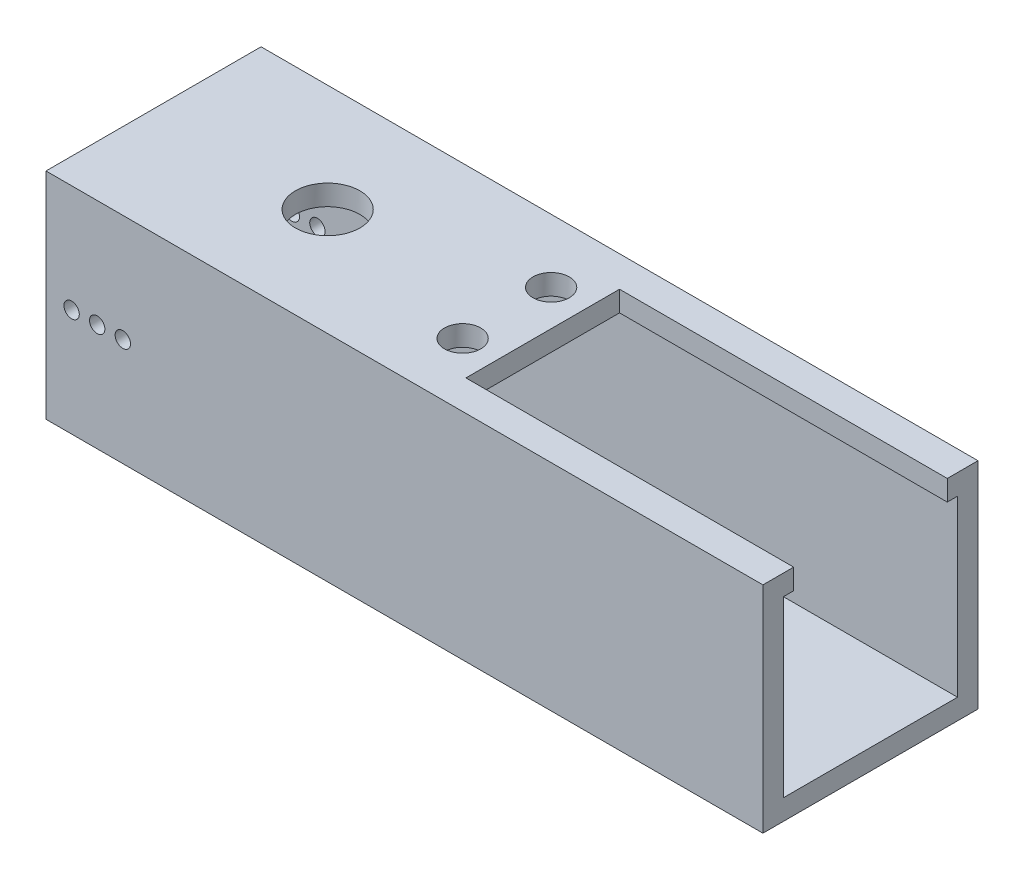
ISO-10303-21;
HEADER;
FILE_DESCRIPTION(('STEP AP214'),'2;1');
FILE_NAME('part.step','',(''),(''),'','','');
FILE_SCHEMA(('AUTOMOTIVE_DESIGN { 1 0 10303 214 1 1 1 1 }'));
ENDSEC;
DATA;
#1=APPLICATION_CONTEXT('core data for automotive mechanical design processes');
#2=APPLICATION_PROTOCOL_DEFINITION('international standard','automotive_design',2000,#1);
#3=PRODUCT_CONTEXT('',#1,'mechanical');
#4=PRODUCT('Part','Part','',(#3));
#5=PRODUCT_RELATED_PRODUCT_CATEGORY('part','',(#4));
#6=PRODUCT_DEFINITION_FORMATION('','',#4);
#7=PRODUCT_DEFINITION_CONTEXT('part definition',#1,'design');
#8=PRODUCT_DEFINITION('design','',#6,#7);
#9=PRODUCT_DEFINITION_SHAPE('','',#8);
#10=(LENGTH_UNIT() NAMED_UNIT(*) SI_UNIT(.MILLI.,.METRE.));
#11=(NAMED_UNIT(*) PLANE_ANGLE_UNIT() SI_UNIT($,.RADIAN.));
#12=(NAMED_UNIT(*) SI_UNIT($,.STERADIAN.) SOLID_ANGLE_UNIT());
#13=UNCERTAINTY_MEASURE_WITH_UNIT(LENGTH_MEASURE(1.E-05),#10,'distance_accuracy_value','');
#14=(GEOMETRIC_REPRESENTATION_CONTEXT(3) GLOBAL_UNCERTAINTY_ASSIGNED_CONTEXT((#13)) GLOBAL_UNIT_ASSIGNED_CONTEXT((#10,
#11,#12)) REPRESENTATION_CONTEXT('',''));
#15=CARTESIAN_POINT('',(0.,0.,0.));
#16=DIRECTION('',(0.,0.,1.));
#17=DIRECTION('',(1.,0.,0.));
#18=AXIS2_PLACEMENT_3D('',#15,#16,#17);
#19=CARTESIAN_POINT('',(88.9,13.335,-13.335));
#20=DIRECTION('',(-1.,0.,0.));
#21=DIRECTION('',(0.,0.,1.));
#22=AXIS2_PLACEMENT_3D('',#19,#20,#21);
#23=PLANE('',#22);
#24=DIRECTION('',(0.,0.,1.));
#25=VECTOR('',#24,1.);
#26=CARTESIAN_POINT('',(88.9,10.795,10.795));
#27=LINE('',#26,#25);
#28=CARTESIAN_POINT('',(88.9,10.795,9.525));
#29=VERTEX_POINT('',#28);
#30=CARTESIAN_POINT('',(88.9,10.795,10.795));
#31=VERTEX_POINT('',#30);
#32=EDGE_CURVE('E161',#29,#31,#27,.T.);
#33=ORIENTED_EDGE('',*,*,#32,.F.);
#34=DIRECTION('',(0.,1.,0.));
#35=VECTOR('',#34,1.);
#36=CARTESIAN_POINT('',(88.9,-13.336,9.525));
#37=LINE('',#36,#35);
#38=CARTESIAN_POINT('',(88.9,13.335,9.525));
#39=VERTEX_POINT('',#38);
#40=EDGE_CURVE('E155',#29,#39,#37,.T.);
#41=ORIENTED_EDGE('',*,*,#40,.T.);
#42=DIRECTION('',(0.,0.,1.));
#43=VECTOR('',#42,1.);
#44=CARTESIAN_POINT('',(88.9,13.335,13.335));
#45=LINE('',#44,#43);
#46=CARTESIAN_POINT('',(88.9,13.335,13.335));
#47=VERTEX_POINT('',#46);
#48=EDGE_CURVE('E192',#39,#47,#45,.T.);
#49=ORIENTED_EDGE('',*,*,#48,.T.);
#50=DIRECTION('',(0.,-1.,0.));
#51=VECTOR('',#50,1.);
#52=CARTESIAN_POINT('',(88.9,-13.335,13.335));
#53=LINE('',#52,#51);
#54=CARTESIAN_POINT('',(88.9,-13.335,13.335));
#55=VERTEX_POINT('',#54);
#56=EDGE_CURVE('E195',#47,#55,#53,.T.);
#57=ORIENTED_EDGE('',*,*,#56,.T.);
#58=DIRECTION('',(0.,0.,-1.));
#59=VECTOR('',#58,1.);
#60=CARTESIAN_POINT('',(88.9,-13.335,13.335));
#61=LINE('',#60,#59);
#62=CARTESIAN_POINT('',(88.9,-13.335,-13.335));
#63=VERTEX_POINT('',#62);
#64=EDGE_CURVE('E197',#55,#63,#61,.T.);
#65=ORIENTED_EDGE('',*,*,#64,.T.);
#66=DIRECTION('',(0.,1.,0.));
#67=VECTOR('',#66,1.);
#68=CARTESIAN_POINT('',(88.9,-13.335,-13.335));
#69=LINE('',#68,#67);
#70=CARTESIAN_POINT('',(88.9,13.335,-13.335));
#71=VERTEX_POINT('',#70);
#72=EDGE_CURVE('E190',#63,#71,#69,.T.);
#73=ORIENTED_EDGE('',*,*,#72,.T.);
#74=CARTESIAN_POINT('',(88.9,13.335,-9.525));
#75=VERTEX_POINT('',#74);
#76=EDGE_CURVE('E154',#71,#75,#45,.T.);
#77=ORIENTED_EDGE('',*,*,#76,.T.);
#78=DIRECTION('',(0.,1.,0.));
#79=VECTOR('',#78,1.);
#80=CARTESIAN_POINT('',(88.9,-13.336,-9.525));
#81=LINE('',#80,#79);
#82=CARTESIAN_POINT('',(88.9,10.795,-9.525));
#83=VERTEX_POINT('',#82);
#84=EDGE_CURVE('E140',#83,#75,#81,.T.);
#85=ORIENTED_EDGE('',*,*,#84,.F.);
#86=CARTESIAN_POINT('',(88.9,10.795,-10.795));
#87=VERTEX_POINT('',#86);
#88=EDGE_CURVE('E152',#87,#83,#27,.T.);
#89=ORIENTED_EDGE('',*,*,#88,.F.);
#90=DIRECTION('',(0.,1.,0.));
#91=VECTOR('',#90,1.);
#92=CARTESIAN_POINT('',(88.9,-10.795,-10.795));
#93=LINE('',#92,#91);
#94=CARTESIAN_POINT('',(88.9,-10.795,-10.795));
#95=VERTEX_POINT('',#94);
#96=EDGE_CURVE('E165',#95,#87,#93,.T.);
#97=ORIENTED_EDGE('',*,*,#96,.F.);
#98=DIRECTION('',(0.,0.,-1.));
#99=VECTOR('',#98,1.);
#100=CARTESIAN_POINT('',(88.9,-10.795,10.795));
#101=LINE('',#100,#99);
#102=CARTESIAN_POINT('',(88.9,-10.795,10.795));
#103=VERTEX_POINT('',#102);
#104=EDGE_CURVE('E279',#103,#95,#101,.T.);
#105=ORIENTED_EDGE('',*,*,#104,.F.);
#106=DIRECTION('',(0.,-1.,0.));
#107=VECTOR('',#106,1.);
#108=CARTESIAN_POINT('',(88.9,-10.795,10.795));
#109=LINE('',#108,#107);
#110=EDGE_CURVE('E181',#31,#103,#109,.T.);
#111=ORIENTED_EDGE('',*,*,#110,.F.);
#112=EDGE_LOOP('',(#33,#41,#49,#57,#65,#73,#77,#85,#89,#97,#105,#111));
#113=FACE_BOUND('',#112,.T.);
#114=ADVANCED_FACE('F44',(#113),#23,.F.);
#115=CARTESIAN_POINT('',(0.,13.335,-13.335));
#116=DIRECTION('',(-1.,0.,0.));
#117=DIRECTION('',(0.,0.,1.));
#118=AXIS2_PLACEMENT_3D('',#115,#116,#117);
#119=PLANE('',#118);
#120=DIRECTION('',(0.,1.,0.));
#121=VECTOR('',#120,1.);
#122=CARTESIAN_POINT('',(0.,-13.335,-13.335));
#123=LINE('',#122,#121);
#124=CARTESIAN_POINT('',(0.,-13.335,-13.335));
#125=VERTEX_POINT('',#124);
#126=CARTESIAN_POINT('',(0.,13.335,-13.335));
#127=VERTEX_POINT('',#126);
#128=EDGE_CURVE('E189',#125,#127,#123,.T.);
#129=ORIENTED_EDGE('',*,*,#128,.F.);
#130=DIRECTION('',(0.,0.,-1.));
#131=VECTOR('',#130,1.);
#132=CARTESIAN_POINT('',(0.,-13.335,13.335));
#133=LINE('',#132,#131);
#134=CARTESIAN_POINT('',(0.,-13.335,13.335));
#135=VERTEX_POINT('',#134);
#136=EDGE_CURVE('E193',#135,#125,#133,.T.);
#137=ORIENTED_EDGE('',*,*,#136,.F.);
#138=DIRECTION('',(0.,-1.,0.));
#139=VECTOR('',#138,1.);
#140=CARTESIAN_POINT('',(0.,-13.335,13.335));
#141=LINE('',#140,#139);
#142=CARTESIAN_POINT('',(0.,13.335,13.335));
#143=VERTEX_POINT('',#142);
#144=EDGE_CURVE('E204',#143,#135,#141,.T.);
#145=ORIENTED_EDGE('',*,*,#144,.F.);
#146=DIRECTION('',(0.,0.,1.));
#147=VECTOR('',#146,1.);
#148=CARTESIAN_POINT('',(0.,13.335,13.335));
#149=LINE('',#148,#147);
#150=EDGE_CURVE('E202',#127,#143,#149,.T.);
#151=ORIENTED_EDGE('',*,*,#150,.F.);
#152=EDGE_LOOP('',(#129,#137,#145,#151));
#153=FACE_BOUND('',#152,.T.);
#154=DIRECTION('',(0.,0.,1.));
#155=VECTOR('',#154,1.);
#156=CARTESIAN_POINT('',(0.,10.795,10.795));
#157=LINE('',#156,#155);
#158=CARTESIAN_POINT('',(0.,10.795,-10.795));
#159=VERTEX_POINT('',#158);
#160=CARTESIAN_POINT('',(0.,10.795,10.795));
#161=VERTEX_POINT('',#160);
#162=EDGE_CURVE('E179',#159,#161,#157,.T.);
#163=ORIENTED_EDGE('',*,*,#162,.T.);
#164=DIRECTION('',(0.,-1.,0.));
#165=VECTOR('',#164,1.);
#166=CARTESIAN_POINT('',(0.,-10.795,10.795));
#167=LINE('',#166,#165);
#168=CARTESIAN_POINT('',(0.,-10.795,10.795));
#169=VERTEX_POINT('',#168);
#170=EDGE_CURVE('E169',#161,#169,#167,.T.);
#171=ORIENTED_EDGE('',*,*,#170,.T.);
#172=DIRECTION('',(0.,0.,-1.));
#173=VECTOR('',#172,1.);
#174=CARTESIAN_POINT('',(0.,-10.795,10.795));
#175=LINE('',#174,#173);
#176=CARTESIAN_POINT('',(0.,-10.795,-10.795));
#177=VERTEX_POINT('',#176);
#178=EDGE_CURVE('E172',#169,#177,#175,.T.);
#179=ORIENTED_EDGE('',*,*,#178,.T.);
#180=DIRECTION('',(0.,1.,0.));
#181=VECTOR('',#180,1.);
#182=CARTESIAN_POINT('',(0.,-10.795,-10.795));
#183=LINE('',#182,#181);
#184=EDGE_CURVE('E176',#177,#159,#183,.T.);
#185=ORIENTED_EDGE('',*,*,#184,.T.);
#186=EDGE_LOOP('',(#163,#171,#179,#185));
#187=FACE_BOUND('',#186,.T.);
#188=ADVANCED_FACE('F293',(#153,#187),#119,.T.);
#189=CARTESIAN_POINT('',(88.9,-13.335,-13.335));
#190=DIRECTION('',(0.,0.,1.));
#191=DIRECTION('',(1.,0.,0.));
#192=AXIS2_PLACEMENT_3D('',#189,#190,#191);
#193=PLANE('',#192);
#194=CARTESIAN_POINT('',(9.525,0.,-13.335));
#195=DIRECTION('',(0.,0.,1.));
#196=DIRECTION('',(1.,0.,0.));
#197=AXIS2_PLACEMENT_3D('',#194,#195,#196);
#198=CIRCLE('',#197,0.9525);
#199=CARTESIAN_POINT('',(10.4775,0.,-13.335));
#200=VERTEX_POINT('',#199);
#201=EDGE_CURVE('E431',#200,#200,#198,.T.);
#202=ORIENTED_EDGE('',*,*,#201,.T.);
#203=EDGE_LOOP('',(#202));
#204=FACE_BOUND('',#203,.T.);
#205=CARTESIAN_POINT('',(3.175,0.,-13.335));
#206=DIRECTION('',(0.,0.,1.));
#207=DIRECTION('',(1.,0.,0.));
#208=AXIS2_PLACEMENT_3D('',#205,#206,#207);
#209=CIRCLE('',#208,0.9525);
#210=CARTESIAN_POINT('',(4.1275,0.,-13.335));
#211=VERTEX_POINT('',#210);
#212=EDGE_CURVE('E225',#211,#211,#209,.T.);
#213=ORIENTED_EDGE('',*,*,#212,.T.);
#214=EDGE_LOOP('',(#213));
#215=FACE_BOUND('',#214,.T.);
#216=CARTESIAN_POINT('',(6.35,0.,-13.335));
#217=DIRECTION('',(0.,0.,1.));
#218=DIRECTION('',(1.,0.,0.));
#219=AXIS2_PLACEMENT_3D('',#216,#217,#218);
#220=CIRCLE('',#219,0.9525);
#221=CARTESIAN_POINT('',(7.3025,0.,-13.335));
#222=VERTEX_POINT('',#221);
#223=EDGE_CURVE('E221',#222,#222,#220,.T.);
#224=ORIENTED_EDGE('',*,*,#223,.T.);
#225=EDGE_LOOP('',(#224));
#226=FACE_BOUND('',#225,.T.);
#227=ORIENTED_EDGE('',*,*,#128,.T.);
#228=DIRECTION('',(-1.,0.,0.));
#229=VECTOR('',#228,1.);
#230=CARTESIAN_POINT('',(88.9,13.335,-13.335));
#231=LINE('',#230,#229);
#232=EDGE_CURVE('E13',#71,#127,#231,.T.);
#233=ORIENTED_EDGE('',*,*,#232,.F.);
#234=ORIENTED_EDGE('',*,*,#72,.F.);
#235=DIRECTION('',(-1.,0.,0.));
#236=VECTOR('',#235,1.);
#237=CARTESIAN_POINT('',(88.9,-13.335,-13.335));
#238=LINE('',#237,#236);
#239=EDGE_CURVE('E199',#63,#125,#238,.T.);
#240=ORIENTED_EDGE('',*,*,#239,.T.);
#241=EDGE_LOOP('',(#227,#233,#234,#240));
#242=FACE_BOUND('',#241,.T.);
#243=ADVANCED_FACE('F46',(#204,#215,#226,#242),#193,.F.);
#244=CARTESIAN_POINT('',(88.9,13.335,13.335));
#245=DIRECTION('',(0.,-1.,0.));
#246=DIRECTION('',(0.,0.,-1.));
#247=AXIS2_PLACEMENT_3D('',#244,#245,#246);
#248=PLANE('',#247);
#249=CARTESIAN_POINT('',(43.815,13.335,5.48774389415743));
#250=DIRECTION('',(0.,1.,0.));
#251=DIRECTION('',(0.,0.,1.));
#252=AXIS2_PLACEMENT_3D('',#249,#250,#251);
#253=CIRCLE('',#252,2.25000000000001);
#254=CARTESIAN_POINT('',(43.815,13.335,7.73774389415744));
#255=VERTEX_POINT('',#254);
#256=EDGE_CURVE('E249',#255,#255,#253,.T.);
#257=ORIENTED_EDGE('',*,*,#256,.F.);
#258=EDGE_LOOP('',(#257));
#259=FACE_BOUND('',#258,.T.);
#260=CARTESIAN_POINT('',(43.815,13.335,-5.4877438941574));
#261=DIRECTION('',(0.,1.,0.));
#262=DIRECTION('',(0.,0.,1.));
#263=AXIS2_PLACEMENT_3D('',#260,#261,#262);
#264=CIRCLE('',#263,2.25);
#265=CARTESIAN_POINT('',(43.815,13.335,-3.2377438941574));
#266=VERTEX_POINT('',#265);
#267=EDGE_CURVE('E255',#266,#266,#264,.T.);
#268=ORIENTED_EDGE('',*,*,#267,.F.);
#269=EDGE_LOOP('',(#268));
#270=FACE_BOUND('',#269,.T.);
#271=ORIENTED_EDGE('',*,*,#48,.F.);
#272=DIRECTION('',(1.,0.,0.));
#273=VECTOR('',#272,1.);
#274=CARTESIAN_POINT('',(48.26,13.335,9.525));
#275=LINE('',#274,#273);
#276=CARTESIAN_POINT('',(48.26,13.335,9.525));
#277=VERTEX_POINT('',#276);
#278=EDGE_CURVE('E262',#277,#39,#275,.T.);
#279=ORIENTED_EDGE('',*,*,#278,.F.);
#280=DIRECTION('',(0.,0.,1.));
#281=VECTOR('',#280,1.);
#282=CARTESIAN_POINT('',(48.26,13.335,-9.525));
#283=LINE('',#282,#281);
#284=CARTESIAN_POINT('',(48.26,13.335,-9.525));
#285=VERTEX_POINT('',#284);
#286=EDGE_CURVE('E144',#285,#277,#283,.T.);
#287=ORIENTED_EDGE('',*,*,#286,.F.);
#288=DIRECTION('',(-1.,0.,0.));
#289=VECTOR('',#288,1.);
#290=CARTESIAN_POINT('',(48.26,13.335,-9.525));
#291=LINE('',#290,#289);
#292=EDGE_CURVE('E264',#75,#285,#291,.T.);
#293=ORIENTED_EDGE('',*,*,#292,.F.);
#294=ORIENTED_EDGE('',*,*,#76,.F.);
#295=ORIENTED_EDGE('',*,*,#232,.T.);
#296=ORIENTED_EDGE('',*,*,#150,.T.);
#297=DIRECTION('',(-1.,0.,0.));
#298=VECTOR('',#297,1.);
#299=CARTESIAN_POINT('',(88.9,13.335,13.335));
#300=LINE('',#299,#298);
#301=EDGE_CURVE('E53',#47,#143,#300,.T.);
#302=ORIENTED_EDGE('',*,*,#301,.F.);
#303=EDGE_LOOP('',(#271,#279,#287,#293,#294,#295,#296,#302));
#304=FACE_BOUND('',#303,.T.);
#305=CARTESIAN_POINT('',(21.59,13.335,0.));
#306=DIRECTION('',(0.,1.,0.));
#307=DIRECTION('',(0.,0.,1.));
#308=AXIS2_PLACEMENT_3D('',#305,#306,#307);
#309=CIRCLE('',#308,4.0005);
#310=CARTESIAN_POINT('',(21.59,13.335,4.0005));
#311=VERTEX_POINT('',#310);
#312=EDGE_CURVE('E272',#311,#311,#309,.T.);
#313=ORIENTED_EDGE('',*,*,#312,.F.);
#314=EDGE_LOOP('',(#313));
#315=FACE_BOUND('',#314,.T.);
#316=ADVANCED_FACE('F300',(#259,#270,#304,#315),#248,.F.);
#317=CARTESIAN_POINT('',(88.9,-13.335,13.335));
#318=DIRECTION('',(0.,0.,-1.));
#319=DIRECTION('',(-1.,0.,0.));
#320=AXIS2_PLACEMENT_3D('',#317,#318,#319);
#321=PLANE('',#320);
#322=CARTESIAN_POINT('',(9.525,0.,13.335));
#323=DIRECTION('',(0.,0.,1.));
#324=DIRECTION('',(1.,0.,0.));
#325=AXIS2_PLACEMENT_3D('',#322,#323,#324);
#326=CIRCLE('',#325,0.9525);
#327=CARTESIAN_POINT('',(10.4775,0.,13.335));
#328=VERTEX_POINT('',#327);
#329=EDGE_CURVE('E432',#328,#328,#326,.T.);
#330=ORIENTED_EDGE('',*,*,#329,.F.);
#331=EDGE_LOOP('',(#330));
#332=FACE_BOUND('',#331,.T.);
#333=CARTESIAN_POINT('',(3.175,0.,13.335));
#334=DIRECTION('',(0.,0.,1.));
#335=DIRECTION('',(1.,0.,0.));
#336=AXIS2_PLACEMENT_3D('',#333,#334,#335);
#337=CIRCLE('',#336,0.9525);
#338=CARTESIAN_POINT('',(4.1275,0.,13.335));
#339=VERTEX_POINT('',#338);
#340=EDGE_CURVE('E232',#339,#339,#337,.T.);
#341=ORIENTED_EDGE('',*,*,#340,.F.);
#342=EDGE_LOOP('',(#341));
#343=FACE_BOUND('',#342,.T.);
#344=CARTESIAN_POINT('',(6.35,0.,13.335));
#345=DIRECTION('',(0.,0.,1.));
#346=DIRECTION('',(1.,0.,0.));
#347=AXIS2_PLACEMENT_3D('',#344,#345,#346);
#348=CIRCLE('',#347,0.9525);
#349=CARTESIAN_POINT('',(7.3025,0.,13.335));
#350=VERTEX_POINT('',#349);
#351=EDGE_CURVE('E229',#350,#350,#348,.T.);
#352=ORIENTED_EDGE('',*,*,#351,.F.);
#353=EDGE_LOOP('',(#352));
#354=FACE_BOUND('',#353,.T.);
#355=ORIENTED_EDGE('',*,*,#144,.T.);
#356=DIRECTION('',(-1.,0.,0.));
#357=VECTOR('',#356,1.);
#358=CARTESIAN_POINT('',(88.9,-13.335,13.335));
#359=LINE('',#358,#357);
#360=EDGE_CURVE('E209',#55,#135,#359,.T.);
#361=ORIENTED_EDGE('',*,*,#360,.F.);
#362=ORIENTED_EDGE('',*,*,#56,.F.);
#363=ORIENTED_EDGE('',*,*,#301,.T.);
#364=EDGE_LOOP('',(#355,#361,#362,#363));
#365=FACE_BOUND('',#364,.T.);
#366=ADVANCED_FACE('F307',(#332,#343,#354,#365),#321,.F.);
#367=CARTESIAN_POINT('',(88.9,-13.335,13.335));
#368=DIRECTION('',(0.,1.,0.));
#369=DIRECTION('',(0.,0.,1.));
#370=AXIS2_PLACEMENT_3D('',#367,#368,#369);
#371=PLANE('',#370);
#372=CARTESIAN_POINT('',(21.59,-13.335,0.));
#373=DIRECTION('',(0.,1.,0.));
#374=DIRECTION('',(0.,0.,1.));
#375=AXIS2_PLACEMENT_3D('',#372,#373,#374);
#376=CIRCLE('',#375,4.0005);
#377=CARTESIAN_POINT('',(21.59,-13.335,4.0005));
#378=VERTEX_POINT('',#377);
#379=EDGE_CURVE('E217',#378,#378,#376,.T.);
#380=ORIENTED_EDGE('',*,*,#379,.T.);
#381=EDGE_LOOP('',(#380));
#382=FACE_BOUND('',#381,.T.);
#383=ORIENTED_EDGE('',*,*,#136,.T.);
#384=ORIENTED_EDGE('',*,*,#239,.F.);
#385=ORIENTED_EDGE('',*,*,#64,.F.);
#386=ORIENTED_EDGE('',*,*,#360,.T.);
#387=EDGE_LOOP('',(#383,#384,#385,#386));
#388=FACE_BOUND('',#387,.T.);
#389=ADVANCED_FACE('F313',(#382,#388),#371,.F.);
#390=CARTESIAN_POINT('',(88.9,-10.795,10.795));
#391=DIRECTION('',(0.,0.,-1.));
#392=DIRECTION('',(-1.,0.,0.));
#393=AXIS2_PLACEMENT_3D('',#390,#391,#392);
#394=PLANE('',#393);
#395=CARTESIAN_POINT('',(9.525,0.,10.795));
#396=DIRECTION('',(0.,0.,-1.));
#397=DIRECTION('',(-1.,0.,0.));
#398=AXIS2_PLACEMENT_3D('',#395,#396,#397);
#399=CIRCLE('',#398,0.9525);
#400=CARTESIAN_POINT('',(8.5725,0.,10.795));
#401=VERTEX_POINT('',#400);
#402=EDGE_CURVE('E237',#401,#401,#399,.T.);
#403=ORIENTED_EDGE('',*,*,#402,.F.);
#404=EDGE_LOOP('',(#403));
#405=FACE_BOUND('',#404,.T.);
#406=CARTESIAN_POINT('',(3.175,0.,10.795));
#407=DIRECTION('',(0.,0.,-1.));
#408=DIRECTION('',(-1.,0.,0.));
#409=AXIS2_PLACEMENT_3D('',#406,#407,#408);
#410=CIRCLE('',#409,0.9525);
#411=CARTESIAN_POINT('',(2.2225,0.,10.795));
#412=VERTEX_POINT('',#411);
#413=EDGE_CURVE('E224',#412,#412,#410,.T.);
#414=ORIENTED_EDGE('',*,*,#413,.F.);
#415=EDGE_LOOP('',(#414));
#416=FACE_BOUND('',#415,.T.);
#417=CARTESIAN_POINT('',(6.35,0.,10.795));
#418=DIRECTION('',(0.,0.,-1.));
#419=DIRECTION('',(-1.,0.,0.));
#420=AXIS2_PLACEMENT_3D('',#417,#418,#419);
#421=CIRCLE('',#420,0.9525);
#422=CARTESIAN_POINT('',(5.3975,0.,10.795));
#423=VERTEX_POINT('',#422);
#424=EDGE_CURVE('E220',#423,#423,#421,.T.);
#425=ORIENTED_EDGE('',*,*,#424,.F.);
#426=EDGE_LOOP('',(#425));
#427=FACE_BOUND('',#426,.T.);
#428=ORIENTED_EDGE('',*,*,#170,.F.);
#429=DIRECTION('',(-1.,0.,0.));
#430=VECTOR('',#429,1.);
#431=CARTESIAN_POINT('',(88.9,10.795,10.795));
#432=LINE('',#431,#430);
#433=EDGE_CURVE('E160',#31,#161,#432,.T.);
#434=ORIENTED_EDGE('',*,*,#433,.F.);
#435=ORIENTED_EDGE('',*,*,#110,.T.);
#436=DIRECTION('',(-1.,0.,0.));
#437=VECTOR('',#436,1.);
#438=CARTESIAN_POINT('',(88.9,-10.795,10.795));
#439=LINE('',#438,#437);
#440=EDGE_CURVE('E186',#103,#169,#439,.T.);
#441=ORIENTED_EDGE('',*,*,#440,.T.);
#442=EDGE_LOOP('',(#428,#434,#435,#441));
#443=FACE_BOUND('',#442,.T.);
#444=ADVANCED_FACE('F290',(#405,#416,#427,#443),#394,.T.);
#445=CARTESIAN_POINT('',(88.9,-10.795,10.795));
#446=DIRECTION('',(0.,1.,0.));
#447=DIRECTION('',(0.,0.,1.));
#448=AXIS2_PLACEMENT_3D('',#445,#446,#447);
#449=PLANE('',#448);
#450=CARTESIAN_POINT('',(21.59,-10.795,0.));
#451=DIRECTION('',(0.,1.,0.));
#452=DIRECTION('',(0.,0.,1.));
#453=AXIS2_PLACEMENT_3D('',#450,#451,#452);
#454=CIRCLE('',#453,4.0005);
#455=CARTESIAN_POINT('',(21.59,-10.795,4.0005));
#456=VERTEX_POINT('',#455);
#457=EDGE_CURVE('E173',#456,#456,#454,.T.);
#458=ORIENTED_EDGE('',*,*,#457,.F.);
#459=EDGE_LOOP('',(#458));
#460=FACE_BOUND('',#459,.T.);
#461=ORIENTED_EDGE('',*,*,#178,.F.);
#462=ORIENTED_EDGE('',*,*,#440,.F.);
#463=ORIENTED_EDGE('',*,*,#104,.T.);
#464=DIRECTION('',(-1.,0.,0.));
#465=VECTOR('',#464,1.);
#466=CARTESIAN_POINT('',(88.9,-10.795,-10.795));
#467=LINE('',#466,#465);
#468=EDGE_CURVE('E184',#95,#177,#467,.T.);
#469=ORIENTED_EDGE('',*,*,#468,.T.);
#470=EDGE_LOOP('',(#461,#462,#463,#469));
#471=FACE_BOUND('',#470,.T.);
#472=ADVANCED_FACE('F291',(#460,#471),#449,.T.);
#473=CARTESIAN_POINT('',(88.9,-10.795,-10.795));
#474=DIRECTION('',(0.,0.,1.));
#475=DIRECTION('',(1.,0.,0.));
#476=AXIS2_PLACEMENT_3D('',#473,#474,#475);
#477=PLANE('',#476);
#478=CARTESIAN_POINT('',(9.525,0.,-10.795));
#479=DIRECTION('',(0.,0.,1.));
#480=DIRECTION('',(1.,0.,0.));
#481=AXIS2_PLACEMENT_3D('',#478,#479,#480);
#482=CIRCLE('',#481,0.9525);
#483=CARTESIAN_POINT('',(10.4775,0.,-10.795));
#484=VERTEX_POINT('',#483);
#485=EDGE_CURVE('E48',#484,#484,#482,.T.);
#486=ORIENTED_EDGE('',*,*,#485,.F.);
#487=EDGE_LOOP('',(#486));
#488=FACE_BOUND('',#487,.T.);
#489=CARTESIAN_POINT('',(3.175,0.,-10.795));
#490=DIRECTION('',(0.,0.,1.));
#491=DIRECTION('',(1.,0.,0.));
#492=AXIS2_PLACEMENT_3D('',#489,#490,#491);
#493=CIRCLE('',#492,0.9525);
#494=CARTESIAN_POINT('',(4.1275,0.,-10.795));
#495=VERTEX_POINT('',#494);
#496=EDGE_CURVE('E222',#495,#495,#493,.T.);
#497=ORIENTED_EDGE('',*,*,#496,.F.);
#498=EDGE_LOOP('',(#497));
#499=FACE_BOUND('',#498,.T.);
#500=CARTESIAN_POINT('',(6.35,0.,-10.795));
#501=DIRECTION('',(0.,0.,1.));
#502=DIRECTION('',(1.,0.,0.));
#503=AXIS2_PLACEMENT_3D('',#500,#501,#502);
#504=CIRCLE('',#503,0.9525);
#505=CARTESIAN_POINT('',(7.3025,0.,-10.795));
#506=VERTEX_POINT('',#505);
#507=EDGE_CURVE('E218',#506,#506,#504,.T.);
#508=ORIENTED_EDGE('',*,*,#507,.F.);
#509=EDGE_LOOP('',(#508));
#510=FACE_BOUND('',#509,.T.);
#511=ORIENTED_EDGE('',*,*,#184,.F.);
#512=ORIENTED_EDGE('',*,*,#468,.F.);
#513=ORIENTED_EDGE('',*,*,#96,.T.);
#514=DIRECTION('',(-1.,0.,0.));
#515=VECTOR('',#514,1.);
#516=CARTESIAN_POINT('',(88.9,10.795,-10.795));
#517=LINE('',#516,#515);
#518=EDGE_CURVE('E69',#87,#159,#517,.T.);
#519=ORIENTED_EDGE('',*,*,#518,.T.);
#520=EDGE_LOOP('',(#511,#512,#513,#519));
#521=FACE_BOUND('',#520,.T.);
#522=ADVANCED_FACE('F286',(#488,#499,#510,#521),#477,.T.);
#523=CARTESIAN_POINT('',(88.9,10.795,10.795));
#524=DIRECTION('',(0.,-1.,0.));
#525=DIRECTION('',(0.,0.,-1.));
#526=AXIS2_PLACEMENT_3D('',#523,#524,#525);
#527=PLANE('',#526);
#528=CARTESIAN_POINT('',(43.815,10.795,5.48774389415743));
#529=DIRECTION('',(0.,-1.,0.));
#530=DIRECTION('',(0.,0.,-1.));
#531=AXIS2_PLACEMENT_3D('',#528,#529,#530);
#532=CIRCLE('',#531,2.25000000000001);
#533=CARTESIAN_POINT('',(43.815,10.795,3.23774389415742));
#534=VERTEX_POINT('',#533);
#535=EDGE_CURVE('E248',#534,#534,#532,.F.);
#536=ORIENTED_EDGE('',*,*,#535,.T.);
#537=EDGE_LOOP('',(#536));
#538=FACE_BOUND('',#537,.T.);
#539=CARTESIAN_POINT('',(43.815,10.795,-5.4877438941574));
#540=DIRECTION('',(0.,-1.,0.));
#541=DIRECTION('',(0.,0.,-1.));
#542=AXIS2_PLACEMENT_3D('',#539,#540,#541);
#543=CIRCLE('',#542,2.25);
#544=CARTESIAN_POINT('',(43.815,10.795,-7.73774389415741));
#545=VERTEX_POINT('',#544);
#546=EDGE_CURVE('E252',#545,#545,#543,.F.);
#547=ORIENTED_EDGE('',*,*,#546,.T.);
#548=EDGE_LOOP('',(#547));
#549=FACE_BOUND('',#548,.T.);
#550=DIRECTION('',(1.,0.,0.));
#551=VECTOR('',#550,1.);
#552=CARTESIAN_POINT('',(48.26,10.795,9.525));
#553=LINE('',#552,#551);
#554=CARTESIAN_POINT('',(48.26,10.795,9.525));
#555=VERTEX_POINT('',#554);
#556=EDGE_CURVE('E266',#555,#29,#553,.T.);
#557=ORIENTED_EDGE('',*,*,#556,.T.);
#558=ORIENTED_EDGE('',*,*,#32,.T.);
#559=ORIENTED_EDGE('',*,*,#433,.T.);
#560=ORIENTED_EDGE('',*,*,#162,.F.);
#561=ORIENTED_EDGE('',*,*,#518,.F.);
#562=ORIENTED_EDGE('',*,*,#88,.T.);
#563=DIRECTION('',(-1.,0.,0.));
#564=VECTOR('',#563,1.);
#565=CARTESIAN_POINT('',(48.26,10.795,-9.525));
#566=LINE('',#565,#564);
#567=CARTESIAN_POINT('',(48.26,10.795,-9.525));
#568=VERTEX_POINT('',#567);
#569=EDGE_CURVE('E136',#83,#568,#566,.T.);
#570=ORIENTED_EDGE('',*,*,#569,.T.);
#571=DIRECTION('',(0.,0.,1.));
#572=VECTOR('',#571,1.);
#573=CARTESIAN_POINT('',(48.26,10.795,-9.525));
#574=LINE('',#573,#572);
#575=EDGE_CURVE('E145',#568,#555,#574,.T.);
#576=ORIENTED_EDGE('',*,*,#575,.T.);
#577=EDGE_LOOP('',(#557,#558,#559,#560,#561,#562,#570,#576));
#578=FACE_BOUND('',#577,.T.);
#579=CARTESIAN_POINT('',(21.59,10.795,0.));
#580=DIRECTION('',(0.,-1.,0.));
#581=DIRECTION('',(0.,0.,-1.));
#582=AXIS2_PLACEMENT_3D('',#579,#580,#581);
#583=CIRCLE('',#582,4.0005);
#584=CARTESIAN_POINT('',(21.59,10.795,-4.0005));
#585=VERTEX_POINT('',#584);
#586=EDGE_CURVE('E214',#585,#585,#583,.T.);
#587=ORIENTED_EDGE('',*,*,#586,.F.);
#588=EDGE_LOOP('',(#587));
#589=FACE_BOUND('',#588,.T.);
#590=ADVANCED_FACE('F158',(#538,#549,#578,#589),#527,.T.);
#591=CARTESIAN_POINT('',(21.59,-13.335,0.));
#592=DIRECTION('',(0.,1.,0.));
#593=DIRECTION('',(0.,0.,1.));
#594=AXIS2_PLACEMENT_3D('',#591,#592,#593);
#595=CYLINDRICAL_SURFACE('',#594,4.0005);
#596=ORIENTED_EDGE('',*,*,#586,.T.);
#597=EDGE_LOOP('',(#596));
#598=FACE_BOUND('',#597,.T.);
#599=ORIENTED_EDGE('',*,*,#312,.T.);
#600=EDGE_LOOP('',(#599));
#601=FACE_BOUND('',#600,.T.);
#602=ADVANCED_FACE('F374',(#598,#601),#595,.F.);
#603=ORIENTED_EDGE('',*,*,#457,.T.);
#604=EDGE_LOOP('',(#603));
#605=FACE_BOUND('',#604,.T.);
#606=ORIENTED_EDGE('',*,*,#379,.F.);
#607=EDGE_LOOP('',(#606));
#608=FACE_BOUND('',#607,.T.);
#609=ADVANCED_FACE('F370',(#605,#608),#595,.F.);
#610=CARTESIAN_POINT('',(48.26,-13.336,9.525));
#611=DIRECTION('',(0.,0.,1.));
#612=DIRECTION('',(1.,0.,0.));
#613=AXIS2_PLACEMENT_3D('',#610,#611,#612);
#614=PLANE('',#613);
#615=DIRECTION('',(0.,1.,0.));
#616=VECTOR('',#615,1.);
#617=CARTESIAN_POINT('',(48.26,-13.336,9.525));
#618=LINE('',#617,#616);
#619=EDGE_CURVE('E61',#555,#277,#618,.T.);
#620=ORIENTED_EDGE('',*,*,#619,.T.);
#621=ORIENTED_EDGE('',*,*,#278,.T.);
#622=ORIENTED_EDGE('',*,*,#40,.F.);
#623=ORIENTED_EDGE('',*,*,#556,.F.);
#624=EDGE_LOOP('',(#620,#621,#622,#623));
#625=FACE_BOUND('',#624,.T.);
#626=ADVANCED_FACE('F295',(#625),#614,.F.);
#627=CARTESIAN_POINT('',(48.26,-13.336,-9.525));
#628=DIRECTION('',(0.,0.,-1.));
#629=DIRECTION('',(-1.,0.,0.));
#630=AXIS2_PLACEMENT_3D('',#627,#628,#629);
#631=PLANE('',#630);
#632=ORIENTED_EDGE('',*,*,#84,.T.);
#633=ORIENTED_EDGE('',*,*,#292,.T.);
#634=DIRECTION('',(0.,1.,0.));
#635=VECTOR('',#634,1.);
#636=CARTESIAN_POINT('',(48.26,-13.336,-9.525));
#637=LINE('',#636,#635);
#638=EDGE_CURVE('E142',#568,#285,#637,.T.);
#639=ORIENTED_EDGE('',*,*,#638,.F.);
#640=ORIENTED_EDGE('',*,*,#569,.F.);
#641=EDGE_LOOP('',(#632,#633,#639,#640));
#642=FACE_BOUND('',#641,.T.);
#643=ADVANCED_FACE('F138',(#642),#631,.F.);
#644=CARTESIAN_POINT('',(48.26,-13.336,-9.525));
#645=DIRECTION('',(-1.,0.,0.));
#646=DIRECTION('',(0.,0.,1.));
#647=AXIS2_PLACEMENT_3D('',#644,#645,#646);
#648=PLANE('',#647);
#649=ORIENTED_EDGE('',*,*,#638,.T.);
#650=ORIENTED_EDGE('',*,*,#286,.T.);
#651=ORIENTED_EDGE('',*,*,#619,.F.);
#652=ORIENTED_EDGE('',*,*,#575,.F.);
#653=EDGE_LOOP('',(#649,#650,#651,#652));
#654=FACE_BOUND('',#653,.T.);
#655=ADVANCED_FACE('F317',(#654),#648,.F.);
#656=CARTESIAN_POINT('',(43.815,-13.336,-5.4877438941574));
#657=DIRECTION('',(0.,1.,0.));
#658=DIRECTION('',(0.,0.,1.));
#659=AXIS2_PLACEMENT_3D('',#656,#657,#658);
#660=CYLINDRICAL_SURFACE('',#659,2.25);
#661=ORIENTED_EDGE('',*,*,#546,.F.);
#662=EDGE_LOOP('',(#661));
#663=FACE_BOUND('',#662,.T.);
#664=ORIENTED_EDGE('',*,*,#267,.T.);
#665=EDGE_LOOP('',(#664));
#666=FACE_BOUND('',#665,.T.);
#667=ADVANCED_FACE('F319',(#663,#666),#660,.F.);
#668=CARTESIAN_POINT('',(43.815,-13.336,5.48774389415743));
#669=DIRECTION('',(0.,1.,0.));
#670=DIRECTION('',(0.,0.,1.));
#671=AXIS2_PLACEMENT_3D('',#668,#669,#670);
#672=CYLINDRICAL_SURFACE('',#671,2.25000000000001);
#673=ORIENTED_EDGE('',*,*,#535,.F.);
#674=EDGE_LOOP('',(#673));
#675=FACE_BOUND('',#674,.T.);
#676=ORIENTED_EDGE('',*,*,#256,.T.);
#677=EDGE_LOOP('',(#676));
#678=FACE_BOUND('',#677,.T.);
#679=ADVANCED_FACE('F325',(#675,#678),#672,.F.);
#680=CARTESIAN_POINT('',(6.35,0.,-13.335));
#681=DIRECTION('',(0.,0.,1.));
#682=DIRECTION('',(1.,0.,0.));
#683=AXIS2_PLACEMENT_3D('',#680,#681,#682);
#684=CYLINDRICAL_SURFACE('',#683,0.9525);
#685=ORIENTED_EDGE('',*,*,#507,.T.);
#686=EDGE_LOOP('',(#685));
#687=FACE_BOUND('',#686,.T.);
#688=ORIENTED_EDGE('',*,*,#223,.F.);
#689=EDGE_LOOP('',(#688));
#690=FACE_BOUND('',#689,.T.);
#691=ADVANCED_FACE('F358',(#687,#690),#684,.F.);
#692=ORIENTED_EDGE('',*,*,#424,.T.);
#693=EDGE_LOOP('',(#692));
#694=FACE_BOUND('',#693,.T.);
#695=ORIENTED_EDGE('',*,*,#351,.T.);
#696=EDGE_LOOP('',(#695));
#697=FACE_BOUND('',#696,.T.);
#698=ADVANCED_FACE('F364',(#694,#697),#684,.F.);
#699=CARTESIAN_POINT('',(3.175,0.,-13.335));
#700=DIRECTION('',(0.,0.,1.));
#701=DIRECTION('',(1.,0.,0.));
#702=AXIS2_PLACEMENT_3D('',#699,#700,#701);
#703=CYLINDRICAL_SURFACE('',#702,0.9525);
#704=ORIENTED_EDGE('',*,*,#496,.T.);
#705=EDGE_LOOP('',(#704));
#706=FACE_BOUND('',#705,.T.);
#707=ORIENTED_EDGE('',*,*,#212,.F.);
#708=EDGE_LOOP('',(#707));
#709=FACE_BOUND('',#708,.T.);
#710=ADVANCED_FACE('F405',(#706,#709),#703,.F.);
#711=ORIENTED_EDGE('',*,*,#413,.T.);
#712=EDGE_LOOP('',(#711));
#713=FACE_BOUND('',#712,.T.);
#714=ORIENTED_EDGE('',*,*,#340,.T.);
#715=EDGE_LOOP('',(#714));
#716=FACE_BOUND('',#715,.T.);
#717=ADVANCED_FACE('F411',(#713,#716),#703,.F.);
#718=CARTESIAN_POINT('',(9.525,0.,-13.335));
#719=DIRECTION('',(0.,0.,1.));
#720=DIRECTION('',(1.,0.,0.));
#721=AXIS2_PLACEMENT_3D('',#718,#719,#720);
#722=CYLINDRICAL_SURFACE('',#721,0.9525);
#723=ORIENTED_EDGE('',*,*,#485,.T.);
#724=EDGE_LOOP('',(#723));
#725=FACE_BOUND('',#724,.T.);
#726=ORIENTED_EDGE('',*,*,#201,.F.);
#727=EDGE_LOOP('',(#726));
#728=FACE_BOUND('',#727,.T.);
#729=ADVANCED_FACE('F415',(#725,#728),#722,.F.);
#730=ORIENTED_EDGE('',*,*,#402,.T.);
#731=EDGE_LOOP('',(#730));
#732=FACE_BOUND('',#731,.T.);
#733=ORIENTED_EDGE('',*,*,#329,.T.);
#734=EDGE_LOOP('',(#733));
#735=FACE_BOUND('',#734,.T.);
#736=ADVANCED_FACE('F420',(#732,#735),#722,.F.);
#737=CLOSED_SHELL('',(#114,#188,#243,#316,#366,#389,#444,#472,#522,#590,#602,#609,#626,#643,
#655,#667,#679,#691,#698,#710,#717,#729,#736));
#738=MANIFOLD_SOLID_BREP('B2',#737);
#739=ADVANCED_BREP_SHAPE_REPRESENTATION('',(#18,#738),#14);
#740=SHAPE_DEFINITION_REPRESENTATION(#9,#739);
ENDSEC;
END-ISO-10303-21;
